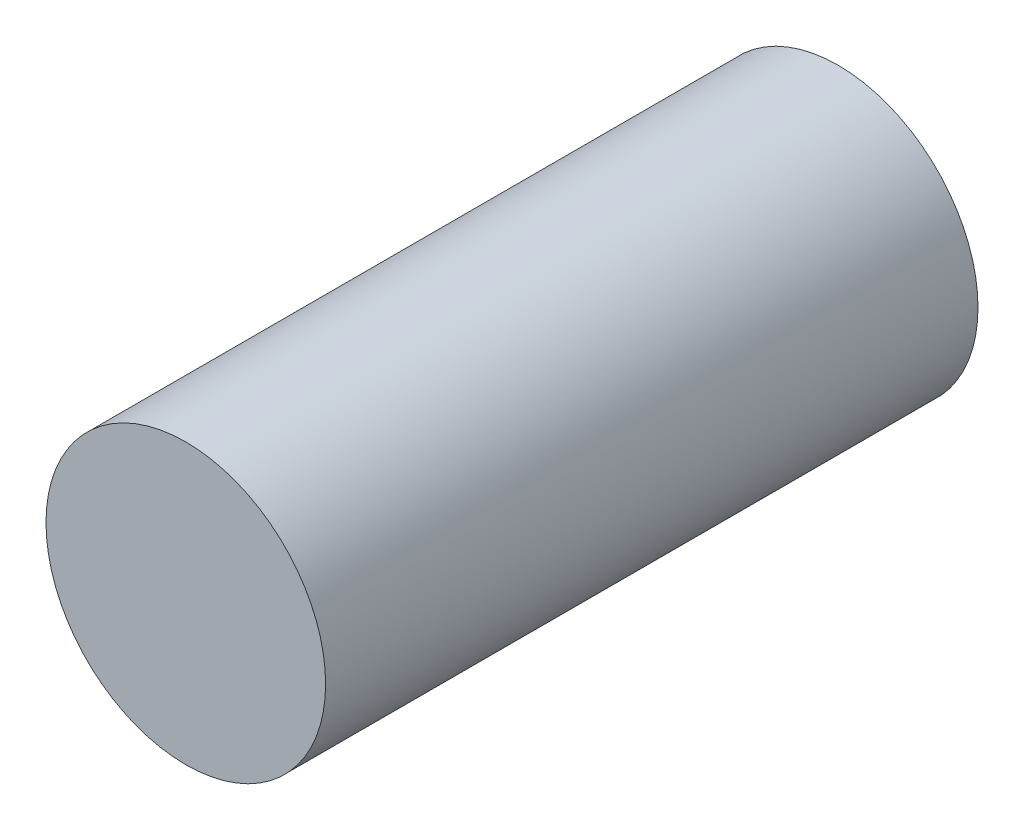
ISO-10303-21;
HEADER;
FILE_DESCRIPTION(('STEP AP214'),'2;1');
FILE_NAME('part.step','',(''),(''),'','','');
FILE_SCHEMA(('AUTOMOTIVE_DESIGN { 1 0 10303 214 1 1 1 1 }'));
ENDSEC;
DATA;
#1=APPLICATION_CONTEXT('core data for automotive mechanical design processes');
#2=APPLICATION_PROTOCOL_DEFINITION('international standard','automotive_design',2000,#1);
#3=PRODUCT_CONTEXT('',#1,'mechanical');
#4=PRODUCT('Part','Part','',(#3));
#5=PRODUCT_RELATED_PRODUCT_CATEGORY('part','',(#4));
#6=PRODUCT_DEFINITION_FORMATION('','',#4);
#7=PRODUCT_DEFINITION_CONTEXT('part definition',#1,'design');
#8=PRODUCT_DEFINITION('design','',#6,#7);
#9=PRODUCT_DEFINITION_SHAPE('','',#8);
#10=(LENGTH_UNIT() NAMED_UNIT(*) SI_UNIT(.MILLI.,.METRE.));
#11=(NAMED_UNIT(*) PLANE_ANGLE_UNIT() SI_UNIT($,.RADIAN.));
#12=(NAMED_UNIT(*) SI_UNIT($,.STERADIAN.) SOLID_ANGLE_UNIT());
#13=UNCERTAINTY_MEASURE_WITH_UNIT(LENGTH_MEASURE(1.E-05),#10,'distance_accuracy_value','');
#14=(GEOMETRIC_REPRESENTATION_CONTEXT(3) GLOBAL_UNCERTAINTY_ASSIGNED_CONTEXT((#13)) GLOBAL_UNIT_ASSIGNED_CONTEXT((#10,
#11,#12)) REPRESENTATION_CONTEXT('',''));
#15=CARTESIAN_POINT('',(0.,0.,0.));
#16=DIRECTION('',(0.,0.,1.));
#17=DIRECTION('',(1.,0.,0.));
#18=AXIS2_PLACEMENT_3D('',#15,#16,#17);
#19=CARTESIAN_POINT('',(0.,0.,70.));
#20=DIRECTION('',(0.,0.,-1.));
#21=DIRECTION('',(-1.,0.,0.));
#22=AXIS2_PLACEMENT_3D('',#19,#20,#21);
#23=CYLINDRICAL_SURFACE('',#22,15.);
#24=CARTESIAN_POINT('',(0.,0.,70.));
#25=DIRECTION('',(0.,0.,1.));
#26=DIRECTION('',(1.,0.,0.));
#27=AXIS2_PLACEMENT_3D('',#24,#25,#26);
#28=CIRCLE('',#27,15.);
#29=CARTESIAN_POINT('',(15.,0.,70.));
#30=VERTEX_POINT('',#29);
#31=EDGE_CURVE('E10',#30,#30,#28,.T.);
#32=ORIENTED_EDGE('',*,*,#31,.F.);
#33=EDGE_LOOP('',(#32));
#34=FACE_BOUND('',#33,.T.);
#35=CARTESIAN_POINT('',(0.,0.,0.));
#36=DIRECTION('',(0.,0.,1.));
#37=DIRECTION('',(1.,0.,0.));
#38=AXIS2_PLACEMENT_3D('',#35,#36,#37);
#39=CIRCLE('',#38,15.);
#40=CARTESIAN_POINT('',(15.,0.,0.));
#41=VERTEX_POINT('',#40);
#42=EDGE_CURVE('E34',#41,#41,#39,.T.);
#43=ORIENTED_EDGE('',*,*,#42,.T.);
#44=EDGE_LOOP('',(#43));
#45=FACE_BOUND('',#44,.T.);
#46=ADVANCED_FACE('F31',(#34,#45),#23,.T.);
#47=CARTESIAN_POINT('',(0.,0.,70.));
#48=DIRECTION('',(0.,0.,1.));
#49=DIRECTION('',(1.,0.,0.));
#50=AXIS2_PLACEMENT_3D('',#47,#48,#49);
#51=PLANE('',#50);
#52=ORIENTED_EDGE('',*,*,#31,.T.);
#53=EDGE_LOOP('',(#52));
#54=FACE_BOUND('',#53,.T.);
#55=ADVANCED_FACE('F46',(#54),#51,.T.);
#56=CARTESIAN_POINT('',(0.,0.,0.));
#57=DIRECTION('',(0.,0.,1.));
#58=DIRECTION('',(1.,0.,0.));
#59=AXIS2_PLACEMENT_3D('',#56,#57,#58);
#60=PLANE('',#59);
#61=ORIENTED_EDGE('',*,*,#42,.F.);
#62=EDGE_LOOP('',(#61));
#63=FACE_BOUND('',#62,.T.);
#64=ADVANCED_FACE('F44',(#63),#60,.F.);
#65=CLOSED_SHELL('',(#46,#55,#64));
#66=MANIFOLD_SOLID_BREP('B2',#65);
#67=ADVANCED_BREP_SHAPE_REPRESENTATION('',(#18,#66),#14);
#68=SHAPE_DEFINITION_REPRESENTATION(#9,#67);
ENDSEC;
END-ISO-10303-21;
